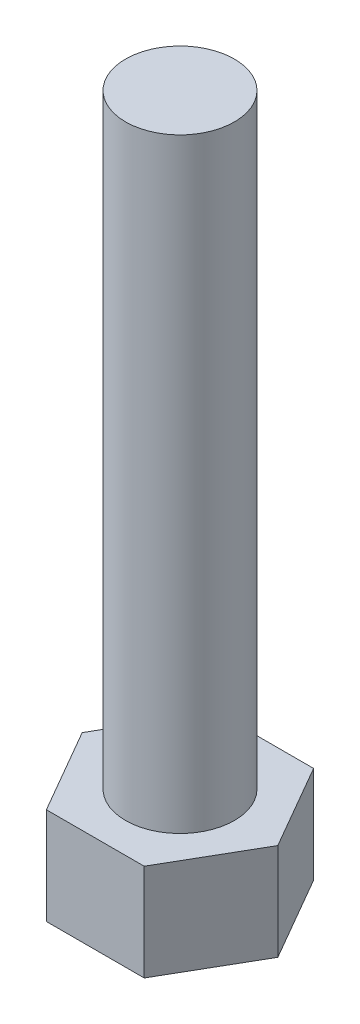
ISO-10303-21;
HEADER;
FILE_DESCRIPTION(('STEP AP214'),'2;1');
FILE_NAME('part.step','',(''),(''),'','','');
FILE_SCHEMA(('AUTOMOTIVE_DESIGN { 1 0 10303 214 1 1 1 1 }'));
ENDSEC;
DATA;
#1=APPLICATION_CONTEXT('core data for automotive mechanical design processes');
#2=APPLICATION_PROTOCOL_DEFINITION('international standard','automotive_design',2000,#1);
#3=PRODUCT_CONTEXT('',#1,'mechanical');
#4=PRODUCT('Part','Part','',(#3));
#5=PRODUCT_RELATED_PRODUCT_CATEGORY('part','',(#4));
#6=PRODUCT_DEFINITION_FORMATION('','',#4);
#7=PRODUCT_DEFINITION_CONTEXT('part definition',#1,'design');
#8=PRODUCT_DEFINITION('design','',#6,#7);
#9=PRODUCT_DEFINITION_SHAPE('','',#8);
#10=(LENGTH_UNIT() NAMED_UNIT(*) SI_UNIT(.MILLI.,.METRE.));
#11=(NAMED_UNIT(*) PLANE_ANGLE_UNIT() SI_UNIT($,.RADIAN.));
#12=(NAMED_UNIT(*) SI_UNIT($,.STERADIAN.) SOLID_ANGLE_UNIT());
#13=UNCERTAINTY_MEASURE_WITH_UNIT(LENGTH_MEASURE(1.E-05),#10,'distance_accuracy_value','');
#14=(GEOMETRIC_REPRESENTATION_CONTEXT(3) GLOBAL_UNCERTAINTY_ASSIGNED_CONTEXT((#13)) GLOBAL_UNIT_ASSIGNED_CONTEXT((#10,
#11,#12)) REPRESENTATION_CONTEXT('',''));
#15=CARTESIAN_POINT('',(0.,0.,0.));
#16=DIRECTION('',(0.,0.,1.));
#17=DIRECTION('',(1.,0.,0.));
#18=AXIS2_PLACEMENT_3D('',#15,#16,#17);
#19=CARTESIAN_POINT('',(-2.02072594216369,4.,3.5));
#20=DIRECTION('',(0.,0.,-1.));
#21=DIRECTION('',(-1.,0.,0.));
#22=AXIS2_PLACEMENT_3D('',#19,#20,#21);
#23=PLANE('',#22);
#24=DIRECTION('',(1.,0.,0.));
#25=VECTOR('',#24,1.);
#26=CARTESIAN_POINT('',(-2.02072594216369,0.,3.5));
#27=LINE('',#26,#25);
#28=CARTESIAN_POINT('',(-2.02072594216369,0.,3.5));
#29=VERTEX_POINT('',#28);
#30=CARTESIAN_POINT('',(2.02072594216369,0.,3.5));
#31=VERTEX_POINT('',#30);
#32=EDGE_CURVE('E123',#29,#31,#27,.T.);
#33=ORIENTED_EDGE('',*,*,#32,.T.);
#34=DIRECTION('',(0.,-1.,0.));
#35=VECTOR('',#34,1.);
#36=CARTESIAN_POINT('',(2.02072594216369,4.,3.5));
#37=LINE('',#36,#35);
#38=CARTESIAN_POINT('',(2.02072594216369,4.,3.5));
#39=VERTEX_POINT('',#38);
#40=EDGE_CURVE('E40',#39,#31,#37,.T.);
#41=ORIENTED_EDGE('',*,*,#40,.F.);
#42=DIRECTION('',(1.,0.,0.));
#43=VECTOR('',#42,1.);
#44=CARTESIAN_POINT('',(-2.02072594216369,4.,3.5));
#45=LINE('',#44,#43);
#46=CARTESIAN_POINT('',(-2.02072594216369,4.,3.5));
#47=VERTEX_POINT('',#46);
#48=EDGE_CURVE('E134',#47,#39,#45,.T.);
#49=ORIENTED_EDGE('',*,*,#48,.F.);
#50=DIRECTION('',(0.,-1.,0.));
#51=VECTOR('',#50,1.);
#52=CARTESIAN_POINT('',(-2.02072594216369,4.,3.5));
#53=LINE('',#52,#51);
#54=EDGE_CURVE('E119',#47,#29,#53,.T.);
#55=ORIENTED_EDGE('',*,*,#54,.T.);
#56=EDGE_LOOP('',(#33,#41,#49,#55));
#57=FACE_BOUND('',#56,.T.);
#58=ADVANCED_FACE('F37',(#57),#23,.F.);
#59=CARTESIAN_POINT('',(2.02072594216369,4.,3.5));
#60=DIRECTION('',(-0.866025403784439,0.,-0.5));
#61=DIRECTION('',(-0.5,0.,0.866025403784439));
#62=AXIS2_PLACEMENT_3D('',#59,#60,#61);
#63=PLANE('',#62);
#64=DIRECTION('',(0.5,0.,-0.866025403784439));
#65=VECTOR('',#64,1.);
#66=CARTESIAN_POINT('',(2.02072594216369,0.,3.5));
#67=LINE('',#66,#65);
#68=CARTESIAN_POINT('',(4.04145188432738,0.,0.));
#69=VERTEX_POINT('',#68);
#70=EDGE_CURVE('E126',#31,#69,#67,.T.);
#71=ORIENTED_EDGE('',*,*,#70,.T.);
#72=DIRECTION('',(0.,-1.,0.));
#73=VECTOR('',#72,1.);
#74=CARTESIAN_POINT('',(4.04145188432738,4.,0.));
#75=LINE('',#74,#73);
#76=CARTESIAN_POINT('',(4.04145188432738,4.,0.));
#77=VERTEX_POINT('',#76);
#78=EDGE_CURVE('E137',#77,#69,#75,.T.);
#79=ORIENTED_EDGE('',*,*,#78,.F.);
#80=DIRECTION('',(0.5,0.,-0.866025403784439));
#81=VECTOR('',#80,1.);
#82=CARTESIAN_POINT('',(2.02072594216369,4.,3.5));
#83=LINE('',#82,#81);
#84=EDGE_CURVE('E92',#39,#77,#83,.T.);
#85=ORIENTED_EDGE('',*,*,#84,.F.);
#86=ORIENTED_EDGE('',*,*,#40,.T.);
#87=EDGE_LOOP('',(#71,#79,#85,#86));
#88=FACE_BOUND('',#87,.T.);
#89=ADVANCED_FACE('F142',(#88),#63,.F.);
#90=CARTESIAN_POINT('',(4.04145188432738,4.,0.));
#91=DIRECTION('',(-0.866025403784439,0.,0.5));
#92=DIRECTION('',(0.5,0.,0.866025403784439));
#93=AXIS2_PLACEMENT_3D('',#90,#91,#92);
#94=PLANE('',#93);
#95=DIRECTION('',(-0.5,0.,-0.866025403784439));
#96=VECTOR('',#95,1.);
#97=CARTESIAN_POINT('',(4.04145188432738,0.,0.));
#98=LINE('',#97,#96);
#99=CARTESIAN_POINT('',(2.02072594216369,0.,-3.5));
#100=VERTEX_POINT('',#99);
#101=EDGE_CURVE('E129',#69,#100,#98,.T.);
#102=ORIENTED_EDGE('',*,*,#101,.T.);
#103=DIRECTION('',(0.,-1.,0.));
#104=VECTOR('',#103,1.);
#105=CARTESIAN_POINT('',(2.02072594216369,4.,-3.5));
#106=LINE('',#105,#104);
#107=CARTESIAN_POINT('',(2.02072594216369,4.,-3.5));
#108=VERTEX_POINT('',#107);
#109=EDGE_CURVE('E114',#108,#100,#106,.T.);
#110=ORIENTED_EDGE('',*,*,#109,.F.);
#111=DIRECTION('',(-0.5,0.,-0.866025403784439));
#112=VECTOR('',#111,1.);
#113=CARTESIAN_POINT('',(4.04145188432738,4.,0.));
#114=LINE('',#113,#112);
#115=EDGE_CURVE('E105',#77,#108,#114,.T.);
#116=ORIENTED_EDGE('',*,*,#115,.F.);
#117=ORIENTED_EDGE('',*,*,#78,.T.);
#118=EDGE_LOOP('',(#102,#110,#116,#117));
#119=FACE_BOUND('',#118,.T.);
#120=ADVANCED_FACE('F148',(#119),#94,.F.);
#121=CARTESIAN_POINT('',(2.02072594216369,4.,-3.5));
#122=DIRECTION('',(0.,0.,1.));
#123=DIRECTION('',(1.,0.,0.));
#124=AXIS2_PLACEMENT_3D('',#121,#122,#123);
#125=PLANE('',#124);
#126=DIRECTION('',(-1.,0.,0.));
#127=VECTOR('',#126,1.);
#128=CARTESIAN_POINT('',(2.02072594216369,0.,-3.5));
#129=LINE('',#128,#127);
#130=CARTESIAN_POINT('',(-2.02072594216369,0.,-3.5));
#131=VERTEX_POINT('',#130);
#132=EDGE_CURVE('E113',#100,#131,#129,.T.);
#133=ORIENTED_EDGE('',*,*,#132,.T.);
#134=DIRECTION('',(0.,-1.,0.));
#135=VECTOR('',#134,1.);
#136=CARTESIAN_POINT('',(-2.02072594216369,4.,-3.5));
#137=LINE('',#136,#135);
#138=CARTESIAN_POINT('',(-2.02072594216369,4.,-3.5));
#139=VERTEX_POINT('',#138);
#140=EDGE_CURVE('E110',#139,#131,#137,.T.);
#141=ORIENTED_EDGE('',*,*,#140,.F.);
#142=DIRECTION('',(-1.,0.,0.));
#143=VECTOR('',#142,1.);
#144=CARTESIAN_POINT('',(2.02072594216369,4.,-3.5));
#145=LINE('',#144,#143);
#146=EDGE_CURVE('E99',#108,#139,#145,.T.);
#147=ORIENTED_EDGE('',*,*,#146,.F.);
#148=ORIENTED_EDGE('',*,*,#109,.T.);
#149=EDGE_LOOP('',(#133,#141,#147,#148));
#150=FACE_BOUND('',#149,.T.);
#151=ADVANCED_FACE('F111',(#150),#125,.F.);
#152=CARTESIAN_POINT('',(-2.02072594216369,4.,-3.5));
#153=DIRECTION('',(0.866025403784439,0.,0.5));
#154=DIRECTION('',(0.5,0.,-0.866025403784439));
#155=AXIS2_PLACEMENT_3D('',#152,#153,#154);
#156=PLANE('',#155);
#157=DIRECTION('',(-0.5,0.,0.866025403784439));
#158=VECTOR('',#157,1.);
#159=CARTESIAN_POINT('',(-2.02072594216369,0.,-3.5));
#160=LINE('',#159,#158);
#161=CARTESIAN_POINT('',(-4.04145188432738,0.,0.));
#162=VERTEX_POINT('',#161);
#163=EDGE_CURVE('E77',#131,#162,#160,.T.);
#164=ORIENTED_EDGE('',*,*,#163,.T.);
#165=DIRECTION('',(0.,-1.,0.));
#166=VECTOR('',#165,1.);
#167=CARTESIAN_POINT('',(-4.04145188432738,4.,0.));
#168=LINE('',#167,#166);
#169=CARTESIAN_POINT('',(-4.04145188432738,4.,0.));
#170=VERTEX_POINT('',#169);
#171=EDGE_CURVE('E115',#170,#162,#168,.T.);
#172=ORIENTED_EDGE('',*,*,#171,.F.);
#173=DIRECTION('',(-0.5,0.,0.866025403784439));
#174=VECTOR('',#173,1.);
#175=CARTESIAN_POINT('',(-2.02072594216369,4.,-3.5));
#176=LINE('',#175,#174);
#177=EDGE_CURVE('E103',#139,#170,#176,.T.);
#178=ORIENTED_EDGE('',*,*,#177,.F.);
#179=ORIENTED_EDGE('',*,*,#140,.T.);
#180=EDGE_LOOP('',(#164,#172,#178,#179));
#181=FACE_BOUND('',#180,.T.);
#182=ADVANCED_FACE('F117',(#181),#156,.F.);
#183=CARTESIAN_POINT('',(-4.04145188432738,4.,0.));
#184=DIRECTION('',(0.866025403784439,0.,-0.5));
#185=DIRECTION('',(-0.5,0.,-0.866025403784439));
#186=AXIS2_PLACEMENT_3D('',#183,#184,#185);
#187=PLANE('',#186);
#188=DIRECTION('',(0.5,0.,0.866025403784439));
#189=VECTOR('',#188,1.);
#190=CARTESIAN_POINT('',(-4.04145188432738,0.,0.));
#191=LINE('',#190,#189);
#192=EDGE_CURVE('E83',#162,#29,#191,.T.);
#193=ORIENTED_EDGE('',*,*,#192,.T.);
#194=ORIENTED_EDGE('',*,*,#54,.F.);
#195=DIRECTION('',(0.5,0.,0.866025403784439));
#196=VECTOR('',#195,1.);
#197=CARTESIAN_POINT('',(-4.04145188432738,4.,0.));
#198=LINE('',#197,#196);
#199=EDGE_CURVE('E54',#170,#47,#198,.T.);
#200=ORIENTED_EDGE('',*,*,#199,.F.);
#201=ORIENTED_EDGE('',*,*,#171,.T.);
#202=EDGE_LOOP('',(#193,#194,#200,#201));
#203=FACE_BOUND('',#202,.T.);
#204=ADVANCED_FACE('F164',(#203),#187,.F.);
#205=CARTESIAN_POINT('',(0.,4.,0.));
#206=DIRECTION('',(0.,1.,0.));
#207=DIRECTION('',(0.,0.,1.));
#208=AXIS2_PLACEMENT_3D('',#205,#206,#207);
#209=PLANE('',#208);
#210=CARTESIAN_POINT('',(0.,4.,0.));
#211=DIRECTION('',(0.,1.,0.));
#212=DIRECTION('',(0.,0.,1.));
#213=AXIS2_PLACEMENT_3D('',#210,#211,#212);
#214=CIRCLE('',#213,2.25);
#215=CARTESIAN_POINT('',(0.,4.,2.25));
#216=VERTEX_POINT('',#215);
#217=EDGE_CURVE('E11',#216,#216,#214,.T.);
#218=ORIENTED_EDGE('',*,*,#217,.F.);
#219=EDGE_LOOP('',(#218));
#220=FACE_BOUND('',#219,.T.);
#221=ORIENTED_EDGE('',*,*,#48,.T.);
#222=ORIENTED_EDGE('',*,*,#84,.T.);
#223=ORIENTED_EDGE('',*,*,#115,.T.);
#224=ORIENTED_EDGE('',*,*,#146,.T.);
#225=ORIENTED_EDGE('',*,*,#177,.T.);
#226=ORIENTED_EDGE('',*,*,#199,.T.);
#227=EDGE_LOOP('',(#221,#222,#223,#224,#225,#226));
#228=FACE_BOUND('',#227,.T.);
#229=ADVANCED_FACE('F101',(#220,#228),#209,.T.);
#230=CARTESIAN_POINT('',(0.,0.,0.));
#231=DIRECTION('',(0.,1.,0.));
#232=DIRECTION('',(0.,0.,1.));
#233=AXIS2_PLACEMENT_3D('',#230,#231,#232);
#234=PLANE('',#233);
#235=ORIENTED_EDGE('',*,*,#32,.F.);
#236=ORIENTED_EDGE('',*,*,#192,.F.);
#237=ORIENTED_EDGE('',*,*,#163,.F.);
#238=ORIENTED_EDGE('',*,*,#132,.F.);
#239=ORIENTED_EDGE('',*,*,#101,.F.);
#240=ORIENTED_EDGE('',*,*,#70,.F.);
#241=EDGE_LOOP('',(#235,#236,#237,#238,#239,#240));
#242=FACE_BOUND('',#241,.T.);
#243=ADVANCED_FACE('F147',(#242),#234,.F.);
#244=CARTESIAN_POINT('',(0.,29.,0.));
#245=DIRECTION('',(0.,-1.,0.));
#246=DIRECTION('',(0.,0.,-1.));
#247=AXIS2_PLACEMENT_3D('',#244,#245,#246);
#248=CYLINDRICAL_SURFACE('',#247,2.25);
#249=CARTESIAN_POINT('',(0.,29.,0.));
#250=DIRECTION('',(0.,1.,0.));
#251=DIRECTION('',(0.,0.,1.));
#252=AXIS2_PLACEMENT_3D('',#249,#250,#251);
#253=CIRCLE('',#252,2.25);
#254=CARTESIAN_POINT('',(0.,29.,2.25));
#255=VERTEX_POINT('',#254);
#256=EDGE_CURVE('E127',#255,#255,#253,.T.);
#257=ORIENTED_EDGE('',*,*,#256,.F.);
#258=EDGE_LOOP('',(#257));
#259=FACE_BOUND('',#258,.T.);
#260=ORIENTED_EDGE('',*,*,#217,.T.);
#261=EDGE_LOOP('',(#260));
#262=FACE_BOUND('',#261,.T.);
#263=ADVANCED_FACE('F157',(#259,#262),#248,.T.);
#264=CARTESIAN_POINT('',(0.,29.,0.));
#265=DIRECTION('',(0.,1.,0.));
#266=DIRECTION('',(0.,0.,1.));
#267=AXIS2_PLACEMENT_3D('',#264,#265,#266);
#268=PLANE('',#267);
#269=ORIENTED_EDGE('',*,*,#256,.T.);
#270=EDGE_LOOP('',(#269));
#271=FACE_BOUND('',#270,.T.);
#272=ADVANCED_FACE('F155',(#271),#268,.T.);
#273=CLOSED_SHELL('',(#58,#89,#120,#151,#182,#204,#229,#243,#263,#272));
#274=MANIFOLD_SOLID_BREP('B2',#273);
#275=ADVANCED_BREP_SHAPE_REPRESENTATION('',(#18,#274),#14);
#276=SHAPE_DEFINITION_REPRESENTATION(#9,#275);
ENDSEC;
END-ISO-10303-21;
